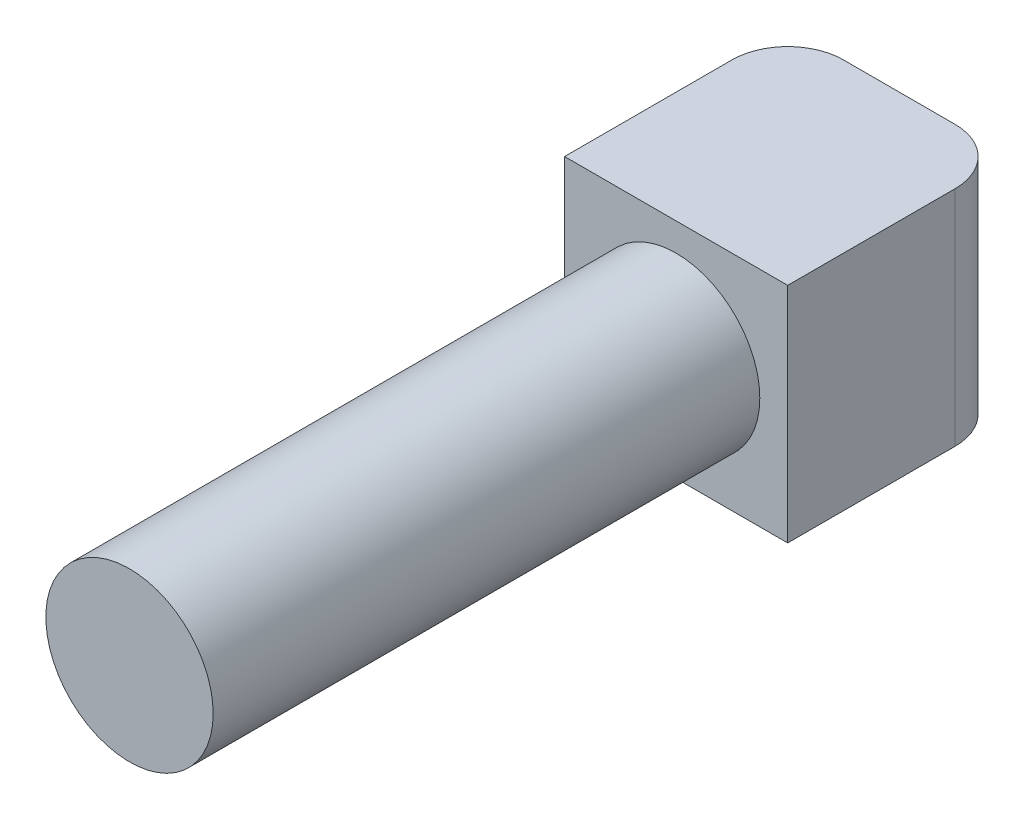
ISO-10303-21;
HEADER;
FILE_DESCRIPTION(('STEP AP214'),'2;1');
FILE_NAME('part.step','',(''),(''),'','','');
FILE_SCHEMA(('AUTOMOTIVE_DESIGN { 1 0 10303 214 1 1 1 1 }'));
ENDSEC;
DATA;
#1=APPLICATION_CONTEXT('core data for automotive mechanical design processes');
#2=APPLICATION_PROTOCOL_DEFINITION('international standard','automotive_design',2000,#1);
#3=PRODUCT_CONTEXT('',#1,'mechanical');
#4=PRODUCT('Part','Part','',(#3));
#5=PRODUCT_RELATED_PRODUCT_CATEGORY('part','',(#4));
#6=PRODUCT_DEFINITION_FORMATION('','',#4);
#7=PRODUCT_DEFINITION_CONTEXT('part definition',#1,'design');
#8=PRODUCT_DEFINITION('design','',#6,#7);
#9=PRODUCT_DEFINITION_SHAPE('','',#8);
#10=(LENGTH_UNIT() NAMED_UNIT(*) SI_UNIT(.MILLI.,.METRE.));
#11=(NAMED_UNIT(*) PLANE_ANGLE_UNIT() SI_UNIT($,.RADIAN.));
#12=(NAMED_UNIT(*) SI_UNIT($,.STERADIAN.) SOLID_ANGLE_UNIT());
#13=UNCERTAINTY_MEASURE_WITH_UNIT(LENGTH_MEASURE(1.E-05),#10,'distance_accuracy_value','');
#14=(GEOMETRIC_REPRESENTATION_CONTEXT(3) GLOBAL_UNCERTAINTY_ASSIGNED_CONTEXT((#13)) GLOBAL_UNIT_ASSIGNED_CONTEXT((#10,
#11,#12)) REPRESENTATION_CONTEXT('',''));
#15=CARTESIAN_POINT('',(0.,0.,0.));
#16=DIRECTION('',(0.,0.,1.));
#17=DIRECTION('',(1.,0.,0.));
#18=AXIS2_PLACEMENT_3D('',#15,#16,#17);
#19=CARTESIAN_POINT('',(4.,0.,0.));
#20=DIRECTION('',(0.,0.,-1.));
#21=DIRECTION('',(-1.,0.,0.));
#22=AXIS2_PLACEMENT_3D('',#19,#20,#21);
#23=PLANE('',#22);
#24=CARTESIAN_POINT('',(2.,2.,0.));
#25=DIRECTION('',(0.,0.,1.));
#26=DIRECTION('',(1.,0.,0.));
#27=AXIS2_PLACEMENT_3D('',#24,#25,#26);
#28=CIRCLE('',#27,1.5);
#29=CARTESIAN_POINT('',(3.5,2.,0.));
#30=VERTEX_POINT('',#29);
#31=EDGE_CURVE('E11',#30,#30,#28,.T.);
#32=ORIENTED_EDGE('',*,*,#31,.F.);
#33=EDGE_LOOP('',(#32));
#34=FACE_BOUND('',#33,.T.);
#35=DIRECTION('',(0.,-1.,0.));
#36=VECTOR('',#35,1.);
#37=CARTESIAN_POINT('',(0.,0.,0.));
#38=LINE('',#37,#36);
#39=CARTESIAN_POINT('',(0.,4.,0.));
#40=VERTEX_POINT('',#39);
#41=CARTESIAN_POINT('',(0.,0.,0.));
#42=VERTEX_POINT('',#41);
#43=EDGE_CURVE('E108',#40,#42,#38,.T.);
#44=ORIENTED_EDGE('',*,*,#43,.T.);
#45=DIRECTION('',(-1.,0.,0.));
#46=VECTOR('',#45,1.);
#47=CARTESIAN_POINT('',(4.,0.,0.));
#48=LINE('',#47,#46);
#49=CARTESIAN_POINT('',(4.,0.,0.));
#50=VERTEX_POINT('',#49);
#51=EDGE_CURVE('E91',#50,#42,#48,.T.);
#52=ORIENTED_EDGE('',*,*,#51,.F.);
#53=DIRECTION('',(0.,-1.,0.));
#54=VECTOR('',#53,1.);
#55=CARTESIAN_POINT('',(4.,0.,0.));
#56=LINE('',#55,#54);
#57=CARTESIAN_POINT('',(4.,4.,0.));
#58=VERTEX_POINT('',#57);
#59=EDGE_CURVE('E97',#58,#50,#56,.T.);
#60=ORIENTED_EDGE('',*,*,#59,.F.);
#61=DIRECTION('',(-1.,0.,0.));
#62=VECTOR('',#61,1.);
#63=CARTESIAN_POINT('',(4.,4.,0.));
#64=LINE('',#63,#62);
#65=EDGE_CURVE('E133',#58,#40,#64,.T.);
#66=ORIENTED_EDGE('',*,*,#65,.T.);
#67=EDGE_LOOP('',(#44,#52,#60,#66));
#68=FACE_BOUND('',#67,.T.);
#69=ADVANCED_FACE('F33',(#34,#68),#23,.F.);
#70=CARTESIAN_POINT('',(4.,0.,0.));
#71=DIRECTION('',(0.,1.,0.));
#72=DIRECTION('',(0.,0.,1.));
#73=AXIS2_PLACEMENT_3D('',#70,#71,#72);
#74=PLANE('',#73);
#75=DIRECTION('',(0.,0.,-1.));
#76=VECTOR('',#75,1.);
#77=CARTESIAN_POINT('',(0.,0.,0.));
#78=LINE('',#77,#76);
#79=CARTESIAN_POINT('',(0.,0.,-3.));
#80=VERTEX_POINT('',#79);
#81=EDGE_CURVE('E138',#42,#80,#78,.T.);
#82=ORIENTED_EDGE('',*,*,#81,.T.);
#83=CARTESIAN_POINT('',(1.,0.,-3.));
#84=DIRECTION('',(0.,1.,0.));
#85=DIRECTION('',(0.,0.,1.));
#86=AXIS2_PLACEMENT_3D('',#83,#84,#85);
#87=CIRCLE('',#86,1.);
#88=CARTESIAN_POINT('',(1.,0.,-4.));
#89=VERTEX_POINT('',#88);
#90=EDGE_CURVE('E126',#80,#89,#87,.F.);
#91=ORIENTED_EDGE('',*,*,#90,.T.);
#92=DIRECTION('',(-1.,0.,0.));
#93=VECTOR('',#92,1.);
#94=CARTESIAN_POINT('',(4.,0.,-4.));
#95=LINE('',#94,#93);
#96=CARTESIAN_POINT('',(3.,0.,-4.));
#97=VERTEX_POINT('',#96);
#98=EDGE_CURVE('E110',#97,#89,#95,.T.);
#99=ORIENTED_EDGE('',*,*,#98,.F.);
#100=CARTESIAN_POINT('',(3.,0.,-3.));
#101=DIRECTION('',(0.,1.,0.));
#102=DIRECTION('',(0.,0.,1.));
#103=AXIS2_PLACEMENT_3D('',#100,#101,#102);
#104=CIRCLE('',#103,1.);
#105=CARTESIAN_POINT('',(4.,0.,-3.));
#106=VERTEX_POINT('',#105);
#107=EDGE_CURVE('E49',#97,#106,#104,.F.);
#108=ORIENTED_EDGE('',*,*,#107,.T.);
#109=DIRECTION('',(0.,0.,-1.));
#110=VECTOR('',#109,1.);
#111=CARTESIAN_POINT('',(4.,0.,0.));
#112=LINE('',#111,#110);
#113=EDGE_CURVE('E87',#50,#106,#112,.T.);
#114=ORIENTED_EDGE('',*,*,#113,.F.);
#115=ORIENTED_EDGE('',*,*,#51,.T.);
#116=EDGE_LOOP('',(#82,#91,#99,#108,#114,#115));
#117=FACE_BOUND('',#116,.T.);
#118=ADVANCED_FACE('F89',(#117),#74,.F.);
#119=CARTESIAN_POINT('',(4.,0.,-4.));
#120=DIRECTION('',(0.,0.,1.));
#121=DIRECTION('',(0.,-1.,0.));
#122=AXIS2_PLACEMENT_3D('',#119,#120,#121);
#123=PLANE('',#122);
#124=ORIENTED_EDGE('',*,*,#98,.T.);
#125=DIRECTION('',(0.,1.,0.));
#126=VECTOR('',#125,1.);
#127=CARTESIAN_POINT('',(1.,4.,-4.));
#128=LINE('',#127,#126);
#129=CARTESIAN_POINT('',(1.,4.,-4.));
#130=VERTEX_POINT('',#129);
#131=EDGE_CURVE('E112',#89,#130,#128,.T.);
#132=ORIENTED_EDGE('',*,*,#131,.T.);
#133=DIRECTION('',(-1.,0.,0.));
#134=VECTOR('',#133,1.);
#135=CARTESIAN_POINT('',(4.,4.,-4.));
#136=LINE('',#135,#134);
#137=CARTESIAN_POINT('',(3.,4.,-4.));
#138=VERTEX_POINT('',#137);
#139=EDGE_CURVE('E115',#138,#130,#136,.T.);
#140=ORIENTED_EDGE('',*,*,#139,.F.);
#141=DIRECTION('',(0.,1.,0.));
#142=VECTOR('',#141,1.);
#143=CARTESIAN_POINT('',(3.,0.,-4.));
#144=LINE('',#143,#142);
#145=EDGE_CURVE('E109',#138,#97,#144,.F.);
#146=ORIENTED_EDGE('',*,*,#145,.T.);
#147=EDGE_LOOP('',(#124,#132,#140,#146));
#148=FACE_BOUND('',#147,.T.);
#149=ADVANCED_FACE('F143',(#148),#123,.F.);
#150=CARTESIAN_POINT('',(4.,4.,0.));
#151=DIRECTION('',(0.,-1.,0.));
#152=DIRECTION('',(0.,0.,-1.));
#153=AXIS2_PLACEMENT_3D('',#150,#151,#152);
#154=PLANE('',#153);
#155=ORIENTED_EDGE('',*,*,#139,.T.);
#156=CARTESIAN_POINT('',(1.,4.,-3.));
#157=DIRECTION('',(0.,-1.,0.));
#158=DIRECTION('',(0.,0.,-1.));
#159=AXIS2_PLACEMENT_3D('',#156,#157,#158);
#160=CIRCLE('',#159,1.);
#161=CARTESIAN_POINT('',(0.,4.,-3.));
#162=VERTEX_POINT('',#161);
#163=EDGE_CURVE('E123',#130,#162,#160,.F.);
#164=ORIENTED_EDGE('',*,*,#163,.T.);
#165=DIRECTION('',(0.,0.,1.));
#166=VECTOR('',#165,1.);
#167=CARTESIAN_POINT('',(0.,4.,0.));
#168=LINE('',#167,#166);
#169=EDGE_CURVE('E105',#162,#40,#168,.T.);
#170=ORIENTED_EDGE('',*,*,#169,.T.);
#171=ORIENTED_EDGE('',*,*,#65,.F.);
#172=DIRECTION('',(0.,0.,1.));
#173=VECTOR('',#172,1.);
#174=CARTESIAN_POINT('',(4.,4.,0.));
#175=LINE('',#174,#173);
#176=CARTESIAN_POINT('',(4.,4.,-3.));
#177=VERTEX_POINT('',#176);
#178=EDGE_CURVE('E96',#177,#58,#175,.T.);
#179=ORIENTED_EDGE('',*,*,#178,.F.);
#180=CARTESIAN_POINT('',(3.,4.,-3.));
#181=DIRECTION('',(0.,-1.,0.));
#182=DIRECTION('',(0.,0.,-1.));
#183=AXIS2_PLACEMENT_3D('',#180,#181,#182);
#184=CIRCLE('',#183,1.);
#185=EDGE_CURVE('E121',#177,#138,#184,.F.);
#186=ORIENTED_EDGE('',*,*,#185,.T.);
#187=EDGE_LOOP('',(#155,#164,#170,#171,#179,#186));
#188=FACE_BOUND('',#187,.T.);
#189=ADVANCED_FACE('F131',(#188),#154,.F.);
#190=CARTESIAN_POINT('',(4.,0.,0.));
#191=DIRECTION('',(-1.,0.,0.));
#192=DIRECTION('',(0.,0.,1.));
#193=AXIS2_PLACEMENT_3D('',#190,#191,#192);
#194=PLANE('',#193);
#195=ORIENTED_EDGE('',*,*,#113,.T.);
#196=DIRECTION('',(0.,1.,0.));
#197=VECTOR('',#196,1.);
#198=CARTESIAN_POINT('',(4.,0.,-3.));
#199=LINE('',#198,#197);
#200=EDGE_CURVE('E37',#106,#177,#199,.T.);
#201=ORIENTED_EDGE('',*,*,#200,.T.);
#202=ORIENTED_EDGE('',*,*,#178,.T.);
#203=ORIENTED_EDGE('',*,*,#59,.T.);
#204=EDGE_LOOP('',(#195,#201,#202,#203));
#205=FACE_BOUND('',#204,.T.);
#206=ADVANCED_FACE('F100',(#205),#194,.F.);
#207=CARTESIAN_POINT('',(0.,0.,0.));
#208=DIRECTION('',(-1.,0.,0.));
#209=DIRECTION('',(0.,0.,1.));
#210=AXIS2_PLACEMENT_3D('',#207,#208,#209);
#211=PLANE('',#210);
#212=ORIENTED_EDGE('',*,*,#169,.F.);
#213=DIRECTION('',(0.,1.,0.));
#214=VECTOR('',#213,1.);
#215=CARTESIAN_POINT('',(0.,0.,-3.));
#216=LINE('',#215,#214);
#217=EDGE_CURVE('E57',#162,#80,#216,.F.);
#218=ORIENTED_EDGE('',*,*,#217,.T.);
#219=ORIENTED_EDGE('',*,*,#81,.F.);
#220=ORIENTED_EDGE('',*,*,#43,.F.);
#221=EDGE_LOOP('',(#212,#218,#219,#220));
#222=FACE_BOUND('',#221,.T.);
#223=ADVANCED_FACE('F155',(#222),#211,.T.);
#224=CARTESIAN_POINT('',(1.,0.,-3.));
#225=DIRECTION('',(0.,-1.,0.));
#226=DIRECTION('',(0.,0.,-1.));
#227=AXIS2_PLACEMENT_3D('',#224,#225,#226);
#228=CYLINDRICAL_SURFACE('',#227,1.);
#229=ORIENTED_EDGE('',*,*,#90,.F.);
#230=ORIENTED_EDGE('',*,*,#217,.F.);
#231=ORIENTED_EDGE('',*,*,#163,.F.);
#232=ORIENTED_EDGE('',*,*,#131,.F.);
#233=EDGE_LOOP('',(#229,#230,#231,#232));
#234=FACE_BOUND('',#233,.T.);
#235=ADVANCED_FACE('F147',(#234),#228,.T.);
#236=CARTESIAN_POINT('',(3.,0.,-3.));
#237=DIRECTION('',(0.,1.,0.));
#238=DIRECTION('',(0.,0.,1.));
#239=AXIS2_PLACEMENT_3D('',#236,#237,#238);
#240=CYLINDRICAL_SURFACE('',#239,1.);
#241=ORIENTED_EDGE('',*,*,#107,.F.);
#242=ORIENTED_EDGE('',*,*,#145,.F.);
#243=ORIENTED_EDGE('',*,*,#185,.F.);
#244=ORIENTED_EDGE('',*,*,#200,.F.);
#245=EDGE_LOOP('',(#241,#242,#243,#244));
#246=FACE_BOUND('',#245,.T.);
#247=ADVANCED_FACE('F35',(#246),#240,.T.);
#248=CARTESIAN_POINT('',(2.,2.,9.8));
#249=DIRECTION('',(0.,0.,-1.));
#250=DIRECTION('',(-1.,0.,0.));
#251=AXIS2_PLACEMENT_3D('',#248,#249,#250);
#252=CYLINDRICAL_SURFACE('',#251,1.5);
#253=CARTESIAN_POINT('',(2.,2.,9.8));
#254=DIRECTION('',(0.,0.,1.));
#255=DIRECTION('',(1.,0.,0.));
#256=AXIS2_PLACEMENT_3D('',#253,#254,#255);
#257=CIRCLE('',#256,1.5);
#258=CARTESIAN_POINT('',(3.5,2.,9.8));
#259=VERTEX_POINT('',#258);
#260=EDGE_CURVE('E139',#259,#259,#257,.T.);
#261=ORIENTED_EDGE('',*,*,#260,.F.);
#262=EDGE_LOOP('',(#261));
#263=FACE_BOUND('',#262,.T.);
#264=ORIENTED_EDGE('',*,*,#31,.T.);
#265=EDGE_LOOP('',(#264));
#266=FACE_BOUND('',#265,.T.);
#267=ADVANCED_FACE('F146',(#263,#266),#252,.T.);
#268=CARTESIAN_POINT('',(2.,2.,9.8));
#269=DIRECTION('',(0.,0.,1.));
#270=DIRECTION('',(1.,0.,0.));
#271=AXIS2_PLACEMENT_3D('',#268,#269,#270);
#272=PLANE('',#271);
#273=ORIENTED_EDGE('',*,*,#260,.T.);
#274=EDGE_LOOP('',(#273));
#275=FACE_BOUND('',#274,.T.);
#276=ADVANCED_FACE('F152',(#275),#272,.T.);
#277=CLOSED_SHELL('',(#69,#118,#149,#189,#206,#223,#235,#247,#267,#276));
#278=MANIFOLD_SOLID_BREP('B2',#277);
#279=ADVANCED_BREP_SHAPE_REPRESENTATION('',(#18,#278),#14);
#280=SHAPE_DEFINITION_REPRESENTATION(#9,#279);
ENDSEC;
END-ISO-10303-21;
